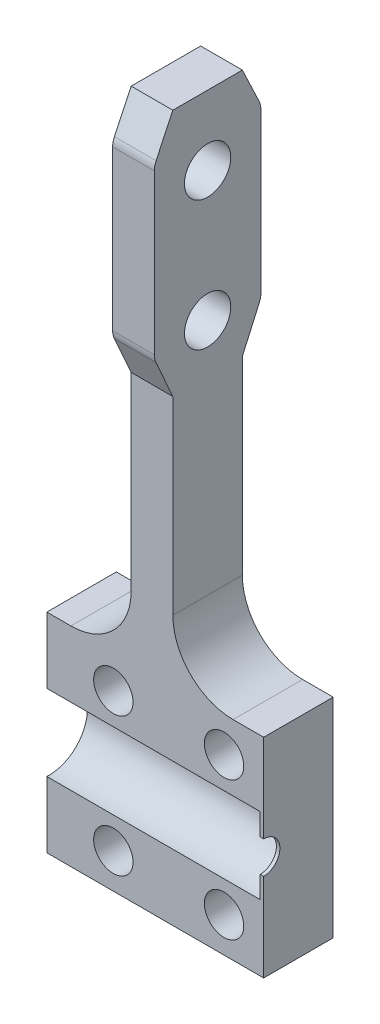
ISO-10303-21;
HEADER;
FILE_DESCRIPTION(('STEP AP214'),'2;1');
FILE_NAME('part.step','',(''),(''),'','','');
FILE_SCHEMA(('AUTOMOTIVE_DESIGN { 1 0 10303 214 1 1 1 1 }'));
ENDSEC;
DATA;
#1=APPLICATION_CONTEXT('core data for automotive mechanical design processes');
#2=APPLICATION_PROTOCOL_DEFINITION('international standard','automotive_design',2000,#1);
#3=PRODUCT_CONTEXT('',#1,'mechanical');
#4=PRODUCT('Part','Part','',(#3));
#5=PRODUCT_RELATED_PRODUCT_CATEGORY('part','',(#4));
#6=PRODUCT_DEFINITION_FORMATION('','',#4);
#7=PRODUCT_DEFINITION_CONTEXT('part definition',#1,'design');
#8=PRODUCT_DEFINITION('design','',#6,#7);
#9=PRODUCT_DEFINITION_SHAPE('','',#8);
#10=(LENGTH_UNIT() NAMED_UNIT(*) SI_UNIT(.MILLI.,.METRE.));
#11=(NAMED_UNIT(*) PLANE_ANGLE_UNIT() SI_UNIT($,.RADIAN.));
#12=(NAMED_UNIT(*) SI_UNIT($,.STERADIAN.) SOLID_ANGLE_UNIT());
#13=UNCERTAINTY_MEASURE_WITH_UNIT(LENGTH_MEASURE(1.E-05),#10,'distance_accuracy_value','');
#14=(GEOMETRIC_REPRESENTATION_CONTEXT(3) GLOBAL_UNCERTAINTY_ASSIGNED_CONTEXT((#13)) GLOBAL_UNIT_ASSIGNED_CONTEXT((#10,
#11,#12)) REPRESENTATION_CONTEXT('',''));
#15=CARTESIAN_POINT('',(0.,0.,0.));
#16=DIRECTION('',(0.,0.,1.));
#17=DIRECTION('',(1.,0.,0.));
#18=AXIS2_PLACEMENT_3D('',#15,#16,#17);
#19=CARTESIAN_POINT('',(13.9,35.5,0.));
#20=DIRECTION('',(0.,0.,1.));
#21=DIRECTION('',(1.,0.,0.));
#22=AXIS2_PLACEMENT_3D('',#19,#20,#21);
#23=PLANE('',#22);
#24=CARTESIAN_POINT('',(-11.95,14.95,0.));
#25=DIRECTION('',(0.,0.,1.));
#26=DIRECTION('',(1.,0.,0.));
#27=AXIS2_PLACEMENT_3D('',#24,#25,#26);
#28=CIRCLE('',#27,4.25);
#29=CARTESIAN_POINT('',(-7.7,14.95,0.));
#30=VERTEX_POINT('',#29);
#31=EDGE_CURVE('E295',#30,#30,#28,.T.);
#32=ORIENTED_EDGE('',*,*,#31,.T.);
#33=EDGE_LOOP('',(#32));
#34=FACE_BOUND('',#33,.T.);
#35=CARTESIAN_POINT('',(11.95,14.95,0.));
#36=DIRECTION('',(0.,0.,1.));
#37=DIRECTION('',(1.,0.,0.));
#38=AXIS2_PLACEMENT_3D('',#35,#36,#37);
#39=CIRCLE('',#38,4.25);
#40=CARTESIAN_POINT('',(16.2,14.95,0.));
#41=VERTEX_POINT('',#40);
#42=EDGE_CURVE('E299',#41,#41,#39,.T.);
#43=ORIENTED_EDGE('',*,*,#42,.T.);
#44=EDGE_LOOP('',(#43));
#45=FACE_BOUND('',#44,.T.);
#46=CARTESIAN_POINT('',(11.95,-14.95,0.));
#47=DIRECTION('',(0.,0.,1.));
#48=DIRECTION('',(1.,0.,0.));
#49=AXIS2_PLACEMENT_3D('',#46,#47,#48);
#50=CIRCLE('',#49,4.25);
#51=CARTESIAN_POINT('',(16.2,-14.95,0.));
#52=VERTEX_POINT('',#51);
#53=EDGE_CURVE('E305',#52,#52,#50,.T.);
#54=ORIENTED_EDGE('',*,*,#53,.T.);
#55=EDGE_LOOP('',(#54));
#56=FACE_BOUND('',#55,.T.);
#57=CARTESIAN_POINT('',(-11.95,-14.95,0.));
#58=DIRECTION('',(0.,0.,1.));
#59=DIRECTION('',(1.,0.,0.));
#60=AXIS2_PLACEMENT_3D('',#57,#58,#59);
#61=CIRCLE('',#60,4.25);
#62=CARTESIAN_POINT('',(-7.7,-14.95,0.));
#63=VERTEX_POINT('',#62);
#64=EDGE_CURVE('E311',#63,#63,#61,.T.);
#65=ORIENTED_EDGE('',*,*,#64,.T.);
#66=EDGE_LOOP('',(#65));
#67=FACE_BOUND('',#66,.T.);
#68=DIRECTION('',(-1.,0.,0.));
#69=VECTOR('',#68,1.);
#70=CARTESIAN_POINT('',(54.5624362774462,76.3868514547035,0.));
#71=LINE('',#70,#69);
#72=CARTESIAN_POINT('',(0.900000000000005,76.3868514547035,0.));
#73=VERTEX_POINT('',#72);
#74=CARTESIAN_POINT('',(-8.09999999999999,76.3868514547035,0.));
#75=VERTEX_POINT('',#74);
#76=EDGE_CURVE('E203',#73,#75,#71,.T.);
#77=ORIENTED_EDGE('',*,*,#76,.F.);
#78=DIRECTION('',(0.,1.,0.));
#79=VECTOR('',#78,1.);
#80=CARTESIAN_POINT('',(0.900000000000005,35.5000000000001,0.));
#81=LINE('',#80,#79);
#82=CARTESIAN_POINT('',(0.900000000000005,35.5000000000001,0.));
#83=VERTEX_POINT('',#82);
#84=EDGE_CURVE('E354',#83,#73,#81,.T.);
#85=ORIENTED_EDGE('',*,*,#84,.F.);
#86=CARTESIAN_POINT('',(13.9,35.5,0.));
#87=DIRECTION('',(0.,0.,-1.));
#88=DIRECTION('',(1.,0.,0.));
#89=AXIS2_PLACEMENT_3D('',#86,#87,#88);
#90=CIRCLE('',#89,13.);
#91=CARTESIAN_POINT('',(13.9000000000001,22.5,0.));
#92=VERTEX_POINT('',#91);
#93=EDGE_CURVE('E352',#92,#83,#90,.T.);
#94=ORIENTED_EDGE('',*,*,#93,.F.);
#95=DIRECTION('',(-1.,0.,0.));
#96=VECTOR('',#95,1.);
#97=CARTESIAN_POINT('',(20.5,22.5,0.));
#98=LINE('',#97,#96);
#99=CARTESIAN_POINT('',(20.5,22.5,0.));
#100=VERTEX_POINT('',#99);
#101=EDGE_CURVE('E350',#100,#92,#98,.T.);
#102=ORIENTED_EDGE('',*,*,#101,.F.);
#103=DIRECTION('',(0.,1.,0.));
#104=VECTOR('',#103,1.);
#105=CARTESIAN_POINT('',(20.5,-22.5,0.));
#106=LINE('',#105,#104);
#107=CARTESIAN_POINT('',(20.5,-22.5,0.));
#108=VERTEX_POINT('',#107);
#109=EDGE_CURVE('E348',#108,#100,#106,.T.);
#110=ORIENTED_EDGE('',*,*,#109,.F.);
#111=DIRECTION('',(1.,0.,0.));
#112=VECTOR('',#111,1.);
#113=CARTESIAN_POINT('',(-26.3,-22.5,0.));
#114=LINE('',#113,#112);
#115=CARTESIAN_POINT('',(-26.3,-22.5,0.));
#116=VERTEX_POINT('',#115);
#117=EDGE_CURVE('E317',#116,#108,#114,.T.);
#118=ORIENTED_EDGE('',*,*,#117,.F.);
#119=DIRECTION('',(0.,-1.,0.));
#120=VECTOR('',#119,1.);
#121=CARTESIAN_POINT('',(-26.3,22.5,0.));
#122=LINE('',#121,#120);
#123=CARTESIAN_POINT('',(-26.3,22.5,0.));
#124=VERTEX_POINT('',#123);
#125=EDGE_CURVE('E324',#124,#116,#122,.T.);
#126=ORIENTED_EDGE('',*,*,#125,.F.);
#127=DIRECTION('',(-1.,0.,0.));
#128=VECTOR('',#127,1.);
#129=CARTESIAN_POINT('',(-8.09999999999999,22.5,0.));
#130=LINE('',#129,#128);
#131=CARTESIAN_POINT('',(-21.1,22.5,0.));
#132=VERTEX_POINT('',#131);
#133=EDGE_CURVE('E361',#132,#124,#130,.T.);
#134=ORIENTED_EDGE('',*,*,#133,.F.);
#135=CARTESIAN_POINT('',(-21.1,35.5,0.));
#136=DIRECTION('',(0.,0.,1.));
#137=DIRECTION('',(1.,0.,0.));
#138=AXIS2_PLACEMENT_3D('',#135,#136,#137);
#139=CIRCLE('',#138,13.);
#140=CARTESIAN_POINT('',(-8.09999999999999,35.5,0.));
#141=VERTEX_POINT('',#140);
#142=EDGE_CURVE('E41',#132,#141,#139,.T.);
#143=ORIENTED_EDGE('',*,*,#142,.T.);
#144=DIRECTION('',(0.,-1.,0.));
#145=VECTOR('',#144,1.);
#146=CARTESIAN_POINT('',(-8.09999999999999,22.5,0.));
#147=LINE('',#146,#145);
#148=EDGE_CURVE('E359',#75,#141,#147,.T.);
#149=ORIENTED_EDGE('',*,*,#148,.F.);
#150=EDGE_LOOP('',(#77,#85,#94,#102,#110,#118,#126,#134,#143,#149));
#151=FACE_BOUND('',#150,.T.);
#152=ADVANCED_FACE('F33',(#34,#45,#56,#67,#151),#23,.F.);
#153=CARTESIAN_POINT('',(13.9,35.5,15.));
#154=DIRECTION('',(0.,0.,1.));
#155=DIRECTION('',(1.,0.,0.));
#156=AXIS2_PLACEMENT_3D('',#153,#154,#155);
#157=PLANE('',#156);
#158=DIRECTION('',(1.,0.,0.));
#159=VECTOR('',#158,1.);
#160=CARTESIAN_POINT('',(-25.55,-3.5,15.));
#161=LINE('',#160,#159);
#162=CARTESIAN_POINT('',(19.75,-3.5,15.));
#163=VERTEX_POINT('',#162);
#164=CARTESIAN_POINT('',(20.5,-3.5,15.));
#165=VERTEX_POINT('',#164);
#166=EDGE_CURVE('E275',#163,#165,#161,.T.);
#167=ORIENTED_EDGE('',*,*,#166,.F.);
#168=DIRECTION('',(0.,-1.,0.));
#169=VECTOR('',#168,1.);
#170=CARTESIAN_POINT('',(19.75,35.5,15.));
#171=LINE('',#170,#169);
#172=CARTESIAN_POINT('',(19.75,-8.2348345460003,15.));
#173=VERTEX_POINT('',#172);
#174=EDGE_CURVE('E386',#163,#173,#171,.T.);
#175=ORIENTED_EDGE('',*,*,#174,.T.);
#176=DIRECTION('',(-1.,0.,0.));
#177=VECTOR('',#176,1.);
#178=CARTESIAN_POINT('',(19.75,-8.2348345460003,15.));
#179=LINE('',#178,#177);
#180=CARTESIAN_POINT('',(-26.3,-8.2348345460003,15.));
#181=VERTEX_POINT('',#180);
#182=EDGE_CURVE('E287',#181,#173,#179,.F.);
#183=ORIENTED_EDGE('',*,*,#182,.F.);
#184=DIRECTION('',(0.,-1.,0.));
#185=VECTOR('',#184,1.);
#186=CARTESIAN_POINT('',(-26.3,22.5,15.));
#187=LINE('',#186,#185);
#188=CARTESIAN_POINT('',(-26.3,-22.5,15.));
#189=VERTEX_POINT('',#188);
#190=EDGE_CURVE('E341',#181,#189,#187,.T.);
#191=ORIENTED_EDGE('',*,*,#190,.T.);
#192=DIRECTION('',(1.,0.,0.));
#193=VECTOR('',#192,1.);
#194=CARTESIAN_POINT('',(-26.3,-22.5,15.));
#195=LINE('',#194,#193);
#196=CARTESIAN_POINT('',(20.5,-22.5,15.));
#197=VERTEX_POINT('',#196);
#198=EDGE_CURVE('E320',#189,#197,#195,.T.);
#199=ORIENTED_EDGE('',*,*,#198,.T.);
#200=DIRECTION('',(0.,1.,0.));
#201=VECTOR('',#200,1.);
#202=CARTESIAN_POINT('',(20.5,-22.5,15.));
#203=LINE('',#202,#201);
#204=EDGE_CURVE('E325',#197,#165,#203,.T.);
#205=ORIENTED_EDGE('',*,*,#204,.T.);
#206=EDGE_LOOP('',(#167,#175,#183,#191,#199,#205));
#207=FACE_BOUND('',#206,.T.);
#208=CARTESIAN_POINT('',(11.95,-14.95,15.));
#209=DIRECTION('',(0.,0.,1.));
#210=DIRECTION('',(1.,0.,0.));
#211=AXIS2_PLACEMENT_3D('',#208,#209,#210);
#212=CIRCLE('',#211,4.25);
#213=CARTESIAN_POINT('',(16.2,-14.95,15.));
#214=VERTEX_POINT('',#213);
#215=EDGE_CURVE('E308',#214,#214,#212,.T.);
#216=ORIENTED_EDGE('',*,*,#215,.F.);
#217=EDGE_LOOP('',(#216));
#218=FACE_BOUND('',#217,.T.);
#219=CARTESIAN_POINT('',(-11.95,-14.95,15.));
#220=DIRECTION('',(0.,0.,1.));
#221=DIRECTION('',(1.,0.,0.));
#222=AXIS2_PLACEMENT_3D('',#219,#220,#221);
#223=CIRCLE('',#222,4.25);
#224=CARTESIAN_POINT('',(-7.7,-14.95,15.));
#225=VERTEX_POINT('',#224);
#226=EDGE_CURVE('E314',#225,#225,#223,.T.);
#227=ORIENTED_EDGE('',*,*,#226,.F.);
#228=EDGE_LOOP('',(#227));
#229=FACE_BOUND('',#228,.T.);
#230=ADVANCED_FACE('F419',(#207,#218,#229),#157,.T.);
#231=DIRECTION('',(-1.,0.,0.));
#232=VECTOR('',#231,1.);
#233=CARTESIAN_POINT('',(54.5624362774462,76.3868514547035,15.));
#234=LINE('',#233,#232);
#235=CARTESIAN_POINT('',(0.900000000000005,76.3868514547035,15.));
#236=VERTEX_POINT('',#235);
#237=CARTESIAN_POINT('',(-8.09999999999999,76.3868514547035,15.));
#238=VERTEX_POINT('',#237);
#239=EDGE_CURVE('E259',#236,#238,#234,.T.);
#240=ORIENTED_EDGE('',*,*,#239,.T.);
#241=DIRECTION('',(0.,-1.,0.));
#242=VECTOR('',#241,1.);
#243=CARTESIAN_POINT('',(-8.09999999999999,22.5,15.));
#244=LINE('',#243,#242);
#245=CARTESIAN_POINT('',(-8.09999999999999,35.5,15.));
#246=VERTEX_POINT('',#245);
#247=EDGE_CURVE('E337',#238,#246,#244,.T.);
#248=ORIENTED_EDGE('',*,*,#247,.T.);
#249=CARTESIAN_POINT('',(-21.1,35.5,15.));
#250=DIRECTION('',(0.,0.,1.));
#251=DIRECTION('',(1.,0.,0.));
#252=AXIS2_PLACEMENT_3D('',#249,#250,#251);
#253=CIRCLE('',#252,13.);
#254=CARTESIAN_POINT('',(-21.1,22.5,15.));
#255=VERTEX_POINT('',#254);
#256=EDGE_CURVE('E11',#246,#255,#253,.F.);
#257=ORIENTED_EDGE('',*,*,#256,.T.);
#258=DIRECTION('',(-1.,0.,0.));
#259=VECTOR('',#258,1.);
#260=CARTESIAN_POINT('',(-8.09999999999999,22.5,15.));
#261=LINE('',#260,#259);
#262=CARTESIAN_POINT('',(-26.3,22.5,15.));
#263=VERTEX_POINT('',#262);
#264=EDGE_CURVE('E339',#255,#263,#261,.T.);
#265=ORIENTED_EDGE('',*,*,#264,.T.);
#266=CARTESIAN_POINT('',(-26.3,8.2348345460003,15.));
#267=VERTEX_POINT('',#266);
#268=EDGE_CURVE('E342',#263,#267,#187,.T.);
#269=ORIENTED_EDGE('',*,*,#268,.T.);
#270=DIRECTION('',(-1.,0.,0.));
#271=VECTOR('',#270,1.);
#272=CARTESIAN_POINT('',(19.75,8.2348345460003,15.));
#273=LINE('',#272,#271);
#274=CARTESIAN_POINT('',(19.75,8.2348345460003,15.));
#275=VERTEX_POINT('',#274);
#276=EDGE_CURVE('E293',#275,#267,#273,.T.);
#277=ORIENTED_EDGE('',*,*,#276,.F.);
#278=CARTESIAN_POINT('',(19.75,3.5,15.));
#279=VERTEX_POINT('',#278);
#280=EDGE_CURVE('E387',#275,#279,#171,.T.);
#281=ORIENTED_EDGE('',*,*,#280,.T.);
#282=DIRECTION('',(1.,0.,0.));
#283=VECTOR('',#282,1.);
#284=CARTESIAN_POINT('',(-25.55,3.5,15.));
#285=LINE('',#284,#283);
#286=CARTESIAN_POINT('',(20.5,3.5,15.));
#287=VERTEX_POINT('',#286);
#288=EDGE_CURVE('E273',#287,#279,#285,.F.);
#289=ORIENTED_EDGE('',*,*,#288,.F.);
#290=CARTESIAN_POINT('',(20.5,22.5,15.));
#291=VERTEX_POINT('',#290);
#292=EDGE_CURVE('E323',#287,#291,#203,.T.);
#293=ORIENTED_EDGE('',*,*,#292,.T.);
#294=DIRECTION('',(-1.,0.,0.));
#295=VECTOR('',#294,1.);
#296=CARTESIAN_POINT('',(20.5,22.5,15.));
#297=LINE('',#296,#295);
#298=CARTESIAN_POINT('',(13.9000000000001,22.5,15.));
#299=VERTEX_POINT('',#298);
#300=EDGE_CURVE('E328',#291,#299,#297,.T.);
#301=ORIENTED_EDGE('',*,*,#300,.T.);
#302=CARTESIAN_POINT('',(13.9,35.5,15.));
#303=DIRECTION('',(0.,0.,-1.));
#304=DIRECTION('',(1.,0.,0.));
#305=AXIS2_PLACEMENT_3D('',#302,#303,#304);
#306=CIRCLE('',#305,13.);
#307=CARTESIAN_POINT('',(0.900000000000005,35.5000000000001,15.));
#308=VERTEX_POINT('',#307);
#309=EDGE_CURVE('E330',#299,#308,#306,.T.);
#310=ORIENTED_EDGE('',*,*,#309,.T.);
#311=DIRECTION('',(0.,1.,0.));
#312=VECTOR('',#311,1.);
#313=CARTESIAN_POINT('',(0.900000000000005,35.5000000000001,15.));
#314=LINE('',#313,#312);
#315=EDGE_CURVE('E332',#308,#236,#314,.T.);
#316=ORIENTED_EDGE('',*,*,#315,.T.);
#317=EDGE_LOOP('',(#240,#248,#257,#265,#269,#277,#281,#289,#293,#301,#310,#316));
#318=FACE_BOUND('',#317,.T.);
#319=CARTESIAN_POINT('',(11.95,14.95,15.));
#320=DIRECTION('',(0.,0.,1.));
#321=DIRECTION('',(1.,0.,0.));
#322=AXIS2_PLACEMENT_3D('',#319,#320,#321);
#323=CIRCLE('',#322,4.25);
#324=CARTESIAN_POINT('',(16.2,14.95,15.));
#325=VERTEX_POINT('',#324);
#326=EDGE_CURVE('E302',#325,#325,#323,.T.);
#327=ORIENTED_EDGE('',*,*,#326,.F.);
#328=EDGE_LOOP('',(#327));
#329=FACE_BOUND('',#328,.T.);
#330=CARTESIAN_POINT('',(-11.95,14.95,15.));
#331=DIRECTION('',(0.,0.,1.));
#332=DIRECTION('',(1.,0.,0.));
#333=AXIS2_PLACEMENT_3D('',#330,#331,#332);
#334=CIRCLE('',#333,4.25);
#335=CARTESIAN_POINT('',(-7.7,14.95,15.));
#336=VERTEX_POINT('',#335);
#337=EDGE_CURVE('E296',#336,#336,#334,.T.);
#338=ORIENTED_EDGE('',*,*,#337,.F.);
#339=EDGE_LOOP('',(#338));
#340=FACE_BOUND('',#339,.T.);
#341=ADVANCED_FACE('F426',(#318,#329,#340),#157,.T.);
#342=CARTESIAN_POINT('',(-26.3,-22.5,15.));
#343=DIRECTION('',(0.,1.,0.));
#344=DIRECTION('',(0.,0.,1.));
#345=AXIS2_PLACEMENT_3D('',#342,#343,#344);
#346=PLANE('',#345);
#347=ORIENTED_EDGE('',*,*,#117,.T.);
#348=DIRECTION('',(0.,0.,-1.));
#349=VECTOR('',#348,1.);
#350=CARTESIAN_POINT('',(20.5,-22.5,15.));
#351=LINE('',#350,#349);
#352=EDGE_CURVE('E383',#197,#108,#351,.T.);
#353=ORIENTED_EDGE('',*,*,#352,.F.);
#354=ORIENTED_EDGE('',*,*,#198,.F.);
#355=DIRECTION('',(0.,0.,-1.));
#356=VECTOR('',#355,1.);
#357=CARTESIAN_POINT('',(-26.3,-22.5,15.));
#358=LINE('',#357,#356);
#359=EDGE_CURVE('E345',#189,#116,#358,.T.);
#360=ORIENTED_EDGE('',*,*,#359,.T.);
#361=EDGE_LOOP('',(#347,#353,#354,#360));
#362=FACE_BOUND('',#361,.T.);
#363=ADVANCED_FACE('F415',(#362),#346,.F.);
#364=CARTESIAN_POINT('',(20.5,-22.5,15.));
#365=DIRECTION('',(-1.,0.,0.));
#366=DIRECTION('',(0.,-1.,0.));
#367=AXIS2_PLACEMENT_3D('',#364,#365,#366);
#368=PLANE('',#367);
#369=ORIENTED_EDGE('',*,*,#292,.F.);
#370=CARTESIAN_POINT('',(20.5,0.,15.));
#371=DIRECTION('',(1.,0.,0.));
#372=DIRECTION('',(0.,1.,0.));
#373=AXIS2_PLACEMENT_3D('',#370,#371,#372);
#374=CIRCLE('',#373,3.5);
#375=EDGE_CURVE('E271',#165,#287,#374,.T.);
#376=ORIENTED_EDGE('',*,*,#375,.F.);
#377=ORIENTED_EDGE('',*,*,#204,.F.);
#378=ORIENTED_EDGE('',*,*,#352,.T.);
#379=ORIENTED_EDGE('',*,*,#109,.T.);
#380=DIRECTION('',(0.,0.,-1.));
#381=VECTOR('',#380,1.);
#382=CARTESIAN_POINT('',(20.5,22.5,15.));
#383=LINE('',#382,#381);
#384=EDGE_CURVE('E380',#291,#100,#383,.T.);
#385=ORIENTED_EDGE('',*,*,#384,.F.);
#386=EDGE_LOOP('',(#369,#376,#377,#378,#379,#385));
#387=FACE_BOUND('',#386,.T.);
#388=ADVANCED_FACE('F467',(#387),#368,.F.);
#389=CARTESIAN_POINT('',(20.5,22.5,15.));
#390=DIRECTION('',(0.,-1.,0.));
#391=DIRECTION('',(0.,0.,-1.));
#392=AXIS2_PLACEMENT_3D('',#389,#390,#391);
#393=PLANE('',#392);
#394=ORIENTED_EDGE('',*,*,#101,.T.);
#395=DIRECTION('',(0.,0.,-1.));
#396=VECTOR('',#395,1.);
#397=CARTESIAN_POINT('',(13.9000000000001,22.5,15.));
#398=LINE('',#397,#396);
#399=EDGE_CURVE('E377',#299,#92,#398,.T.);
#400=ORIENTED_EDGE('',*,*,#399,.F.);
#401=ORIENTED_EDGE('',*,*,#300,.F.);
#402=ORIENTED_EDGE('',*,*,#384,.T.);
#403=EDGE_LOOP('',(#394,#400,#401,#402));
#404=FACE_BOUND('',#403,.T.);
#405=ADVANCED_FACE('F463',(#404),#393,.F.);
#406=CARTESIAN_POINT('',(13.9,35.5,15.));
#407=DIRECTION('',(0.,0.,-1.));
#408=DIRECTION('',(-1.,0.,0.));
#409=AXIS2_PLACEMENT_3D('',#406,#407,#408);
#410=CYLINDRICAL_SURFACE('',#409,13.);
#411=ORIENTED_EDGE('',*,*,#93,.T.);
#412=DIRECTION('',(0.,0.,-1.));
#413=VECTOR('',#412,1.);
#414=CARTESIAN_POINT('',(0.900000000000005,35.5000000000001,15.));
#415=LINE('',#414,#413);
#416=EDGE_CURVE('E374',#308,#83,#415,.T.);
#417=ORIENTED_EDGE('',*,*,#416,.F.);
#418=ORIENTED_EDGE('',*,*,#309,.F.);
#419=ORIENTED_EDGE('',*,*,#399,.T.);
#420=EDGE_LOOP('',(#411,#417,#418,#419));
#421=FACE_BOUND('',#420,.T.);
#422=ADVANCED_FACE('F459',(#421),#410,.F.);
#423=CARTESIAN_POINT('',(0.900000000000005,35.5000000000001,15.));
#424=DIRECTION('',(-1.,0.,0.));
#425=DIRECTION('',(0.,0.,1.));
#426=AXIS2_PLACEMENT_3D('',#423,#424,#425);
#427=PLANE('',#426);
#428=CARTESIAN_POINT('',(0.900000000000005,86.9,7.5));
#429=DIRECTION('',(1.,0.,0.));
#430=DIRECTION('',(0.,0.,-1.));
#431=AXIS2_PLACEMENT_3D('',#428,#429,#430);
#432=CIRCLE('',#431,5.);
#433=CARTESIAN_POINT('',(0.900000000000005,86.9,2.5));
#434=VERTEX_POINT('',#433);
#435=EDGE_CURVE('E278',#434,#434,#432,.T.);
#436=ORIENTED_EDGE('',*,*,#435,.F.);
#437=EDGE_LOOP('',(#436));
#438=FACE_BOUND('',#437,.T.);
#439=CARTESIAN_POINT('',(0.900000000000005,114.9,7.5));
#440=DIRECTION('',(1.,0.,0.));
#441=DIRECTION('',(0.,0.,-1.));
#442=AXIS2_PLACEMENT_3D('',#439,#440,#441);
#443=CIRCLE('',#442,5.);
#444=CARTESIAN_POINT('',(0.900000000000005,114.9,2.5));
#445=VERTEX_POINT('',#444);
#446=EDGE_CURVE('E277',#445,#445,#443,.T.);
#447=ORIENTED_EDGE('',*,*,#446,.F.);
#448=EDGE_LOOP('',(#447));
#449=FACE_BOUND('',#448,.T.);
#450=ORIENTED_EDGE('',*,*,#84,.T.);
#451=DIRECTION('',(0.,0.912907574661992,-0.40816633879432));
#452=VECTOR('',#451,1.);
#453=CARTESIAN_POINT('',(0.900000000000005,76.3868514547035,0.));
#454=LINE('',#453,#452);
#455=CARTESIAN_POINT('',(0.900000000000005,84.5541123056302,-3.65163029864797));
#456=VERTEX_POINT('',#455);
#457=EDGE_CURVE('E232',#73,#456,#454,.T.);
#458=ORIENTED_EDGE('',*,*,#457,.T.);
#459=CARTESIAN_POINT('',(0.900000000000005,86.1867776608075,0.));
#460=DIRECTION('',(-1.,0.,0.));
#461=DIRECTION('',(0.,0.,1.));
#462=AXIS2_PLACEMENT_3D('',#459,#460,#461);
#463=CIRCLE('',#462,4.);
#464=CARTESIAN_POINT('',(0.900000000000005,86.1867776608075,-3.99999999999999));
#465=VERTEX_POINT('',#464);
#466=EDGE_CURVE('E200',#456,#465,#463,.F.);
#467=ORIENTED_EDGE('',*,*,#466,.T.);
#468=DIRECTION('',(0.,1.,0.));
#469=VECTOR('',#468,1.);
#470=CARTESIAN_POINT('',(0.900000000000005,86.1867776608075,-3.99999999999999));
#471=LINE('',#470,#469);
#472=CARTESIAN_POINT('',(0.900000000000005,120.550049195899,-4.));
#473=VERTEX_POINT('',#472);
#474=EDGE_CURVE('E770',#465,#473,#471,.T.);
#475=ORIENTED_EDGE('',*,*,#474,.T.);
#476=CARTESIAN_POINT('',(0.900000000000005,120.550049195899,0.));
#477=DIRECTION('',(-1.,0.,0.));
#478=DIRECTION('',(0.,0.,1.));
#479=AXIS2_PLACEMENT_3D('',#476,#477,#478);
#480=CIRCLE('',#479,4.);
#481=CARTESIAN_POINT('',(0.900000000000005,122.261288146267,-3.61547524604226));
#482=VERTEX_POINT('',#481);
#483=EDGE_CURVE('E771',#473,#482,#480,.F.);
#484=ORIENTED_EDGE('',*,*,#483,.T.);
#485=DIRECTION('',(0.,0.903868811510564,0.427809737591936));
#486=VECTOR('',#485,1.);
#487=CARTESIAN_POINT('',(0.900000000000005,122.261288146267,-3.61547524604226));
#488=LINE('',#487,#486);
#489=CARTESIAN_POINT('',(0.900000000000005,129.9,0.));
#490=VERTEX_POINT('',#489);
#491=EDGE_CURVE('E226',#482,#490,#488,.T.);
#492=ORIENTED_EDGE('',*,*,#491,.T.);
#493=DIRECTION('',(0.,0.,-1.));
#494=VECTOR('',#493,1.);
#495=CARTESIAN_POINT('',(0.900000000000005,129.9,15.));
#496=LINE('',#495,#494);
#497=CARTESIAN_POINT('',(0.900000000000005,129.9,15.));
#498=VERTEX_POINT('',#497);
#499=EDGE_CURVE('E372',#498,#490,#496,.T.);
#500=ORIENTED_EDGE('',*,*,#499,.F.);
#501=DIRECTION('',(0.,-0.903868811510564,0.427809737591936));
#502=VECTOR('',#501,1.);
#503=CARTESIAN_POINT('',(0.900000000000005,122.261288146267,18.6154752460423));
#504=LINE('',#503,#502);
#505=CARTESIAN_POINT('',(0.900000000000005,122.261288146267,18.6154752460423));
#506=VERTEX_POINT('',#505);
#507=EDGE_CURVE('E242',#498,#506,#504,.T.);
#508=ORIENTED_EDGE('',*,*,#507,.T.);
#509=CARTESIAN_POINT('',(0.900000000000005,120.550049195899,15.));
#510=DIRECTION('',(-1.,0.,0.));
#511=DIRECTION('',(0.,0.,1.));
#512=AXIS2_PLACEMENT_3D('',#509,#510,#511);
#513=CIRCLE('',#512,4.);
#514=CARTESIAN_POINT('',(0.900000000000005,120.550049195899,19.));
#515=VERTEX_POINT('',#514);
#516=EDGE_CURVE('E240',#506,#515,#513,.F.);
#517=ORIENTED_EDGE('',*,*,#516,.T.);
#518=DIRECTION('',(0.,-1.,0.));
#519=VECTOR('',#518,1.);
#520=CARTESIAN_POINT('',(0.900000000000005,86.1867776608075,19.));
#521=LINE('',#520,#519);
#522=CARTESIAN_POINT('',(0.900000000000005,86.1867776608075,19.));
#523=VERTEX_POINT('',#522);
#524=EDGE_CURVE('E237',#515,#523,#521,.T.);
#525=ORIENTED_EDGE('',*,*,#524,.T.);
#526=CARTESIAN_POINT('',(0.900000000000005,86.1867776608075,15.));
#527=DIRECTION('',(-1.,0.,0.));
#528=DIRECTION('',(0.,0.,1.));
#529=AXIS2_PLACEMENT_3D('',#526,#527,#528);
#530=CIRCLE('',#529,4.);
#531=CARTESIAN_POINT('',(0.900000000000005,84.5541123056302,18.651630298648));
#532=VERTEX_POINT('',#531);
#533=EDGE_CURVE('E235',#523,#532,#530,.F.);
#534=ORIENTED_EDGE('',*,*,#533,.T.);
#535=DIRECTION('',(0.,-0.912907574661992,-0.408166338794321));
#536=VECTOR('',#535,1.);
#537=CARTESIAN_POINT('',(0.900000000000005,76.3868514547035,15.));
#538=LINE('',#537,#536);
#539=EDGE_CURVE('E244',#532,#236,#538,.T.);
#540=ORIENTED_EDGE('',*,*,#539,.T.);
#541=ORIENTED_EDGE('',*,*,#315,.F.);
#542=ORIENTED_EDGE('',*,*,#416,.T.);
#543=EDGE_LOOP('',(#450,#458,#467,#475,#484,#492,#500,#508,#517,#525,#534,#540,#541,#542));
#544=FACE_BOUND('',#543,.T.);
#545=ADVANCED_FACE('F455',(#438,#449,#544),#427,.F.);
#546=CARTESIAN_POINT('',(-8.09999999999999,129.9,15.));
#547=DIRECTION('',(0.,-1.,0.));
#548=DIRECTION('',(0.,0.,-1.));
#549=AXIS2_PLACEMENT_3D('',#546,#547,#548);
#550=PLANE('',#549);
#551=DIRECTION('',(-1.,0.,0.));
#552=VECTOR('',#551,1.);
#553=CARTESIAN_POINT('',(-8.09999999999999,129.9,0.));
#554=LINE('',#553,#552);
#555=CARTESIAN_POINT('',(-8.09999999999999,129.9,0.));
#556=VERTEX_POINT('',#555);
#557=EDGE_CURVE('E357',#490,#556,#554,.T.);
#558=ORIENTED_EDGE('',*,*,#557,.T.);
#559=DIRECTION('',(0.,0.,-1.));
#560=VECTOR('',#559,1.);
#561=CARTESIAN_POINT('',(-8.09999999999999,129.9,15.));
#562=LINE('',#561,#560);
#563=CARTESIAN_POINT('',(-8.09999999999999,129.9,15.));
#564=VERTEX_POINT('',#563);
#565=EDGE_CURVE('E369',#564,#556,#562,.T.);
#566=ORIENTED_EDGE('',*,*,#565,.F.);
#567=DIRECTION('',(-1.,0.,0.));
#568=VECTOR('',#567,1.);
#569=CARTESIAN_POINT('',(-8.09999999999999,129.9,15.));
#570=LINE('',#569,#568);
#571=EDGE_CURVE('E334',#498,#564,#570,.T.);
#572=ORIENTED_EDGE('',*,*,#571,.F.);
#573=ORIENTED_EDGE('',*,*,#499,.T.);
#574=EDGE_LOOP('',(#558,#566,#572,#573));
#575=FACE_BOUND('',#574,.T.);
#576=ADVANCED_FACE('F451',(#575),#550,.F.);
#577=CARTESIAN_POINT('',(-8.09999999999999,22.5,15.));
#578=DIRECTION('',(1.,0.,0.));
#579=DIRECTION('',(0.,0.,-1.));
#580=AXIS2_PLACEMENT_3D('',#577,#578,#579);
#581=PLANE('',#580);
#582=CARTESIAN_POINT('',(-8.1,86.9,7.5));
#583=DIRECTION('',(1.,0.,0.));
#584=DIRECTION('',(0.,0.,-1.));
#585=AXIS2_PLACEMENT_3D('',#582,#583,#584);
#586=CIRCLE('',#585,5.);
#587=CARTESIAN_POINT('',(-8.1,86.9,2.5));
#588=VERTEX_POINT('',#587);
#589=EDGE_CURVE('E290',#588,#588,#586,.T.);
#590=ORIENTED_EDGE('',*,*,#589,.T.);
#591=EDGE_LOOP('',(#590));
#592=FACE_BOUND('',#591,.T.);
#593=CARTESIAN_POINT('',(-8.1,114.9,7.5));
#594=DIRECTION('',(1.,0.,0.));
#595=DIRECTION('',(0.,0.,-1.));
#596=AXIS2_PLACEMENT_3D('',#593,#594,#595);
#597=CIRCLE('',#596,5.);
#598=CARTESIAN_POINT('',(-8.1,114.9,2.5));
#599=VERTEX_POINT('',#598);
#600=EDGE_CURVE('E281',#599,#599,#597,.T.);
#601=ORIENTED_EDGE('',*,*,#600,.T.);
#602=EDGE_LOOP('',(#601));
#603=FACE_BOUND('',#602,.T.);
#604=ORIENTED_EDGE('',*,*,#148,.T.);
#605=DIRECTION('',(0.,0.,-1.));
#606=VECTOR('',#605,1.);
#607=CARTESIAN_POINT('',(-8.09999999999999,35.5,15.));
#608=LINE('',#607,#606);
#609=EDGE_CURVE('E48',#141,#246,#608,.F.);
#610=ORIENTED_EDGE('',*,*,#609,.T.);
#611=ORIENTED_EDGE('',*,*,#247,.F.);
#612=DIRECTION('',(0.,0.912907574661992,0.408166338794321));
#613=VECTOR('',#612,1.);
#614=CARTESIAN_POINT('',(-8.09999999999999,76.3868514547035,15.));
#615=LINE('',#614,#613);
#616=CARTESIAN_POINT('',(-8.09999999999999,84.5541123056302,18.651630298648));
#617=VERTEX_POINT('',#616);
#618=EDGE_CURVE('E234',#238,#617,#615,.T.);
#619=ORIENTED_EDGE('',*,*,#618,.T.);
#620=CARTESIAN_POINT('',(-8.09999999999999,86.1867776608075,15.));
#621=DIRECTION('',(-1.,0.,0.));
#622=DIRECTION('',(0.,0.,1.));
#623=AXIS2_PLACEMENT_3D('',#620,#621,#622);
#624=CIRCLE('',#623,4.);
#625=CARTESIAN_POINT('',(-8.09999999999999,86.1867776608075,19.));
#626=VERTEX_POINT('',#625);
#627=EDGE_CURVE('E247',#617,#626,#624,.T.);
#628=ORIENTED_EDGE('',*,*,#627,.T.);
#629=DIRECTION('',(0.,1.,0.));
#630=VECTOR('',#629,1.);
#631=CARTESIAN_POINT('',(-8.09999999999999,86.1867776608075,19.));
#632=LINE('',#631,#630);
#633=CARTESIAN_POINT('',(-8.09999999999999,120.550049195899,19.));
#634=VERTEX_POINT('',#633);
#635=EDGE_CURVE('E250',#626,#634,#632,.T.);
#636=ORIENTED_EDGE('',*,*,#635,.T.);
#637=CARTESIAN_POINT('',(-8.09999999999999,120.550049195899,15.));
#638=DIRECTION('',(-1.,0.,0.));
#639=DIRECTION('',(0.,0.,1.));
#640=AXIS2_PLACEMENT_3D('',#637,#638,#639);
#641=CIRCLE('',#640,4.);
#642=CARTESIAN_POINT('',(-8.09999999999999,122.261288146267,18.6154752460423));
#643=VERTEX_POINT('',#642);
#644=EDGE_CURVE('E253',#634,#643,#641,.T.);
#645=ORIENTED_EDGE('',*,*,#644,.T.);
#646=DIRECTION('',(0.,0.903868811510564,-0.427809737591936));
#647=VECTOR('',#646,1.);
#648=CARTESIAN_POINT('',(-8.09999999999999,122.261288146267,18.6154752460423));
#649=LINE('',#648,#647);
#650=EDGE_CURVE('E256',#643,#564,#649,.T.);
#651=ORIENTED_EDGE('',*,*,#650,.T.);
#652=ORIENTED_EDGE('',*,*,#565,.T.);
#653=DIRECTION('',(0.,-0.903868811510564,-0.427809737591936));
#654=VECTOR('',#653,1.);
#655=CARTESIAN_POINT('',(-8.09999999999999,122.261288146267,-3.61547524604226));
#656=LINE('',#655,#654);
#657=CARTESIAN_POINT('',(-8.09999999999999,122.261288146267,-3.61547524604226));
#658=VERTEX_POINT('',#657);
#659=EDGE_CURVE('E210',#556,#658,#656,.T.);
#660=ORIENTED_EDGE('',*,*,#659,.T.);
#661=CARTESIAN_POINT('',(-8.09999999999999,120.550049195899,0.));
#662=DIRECTION('',(-1.,0.,0.));
#663=DIRECTION('',(0.,0.,-1.));
#664=AXIS2_PLACEMENT_3D('',#661,#662,#663);
#665=CIRCLE('',#664,4.);
#666=CARTESIAN_POINT('',(-8.09999999999999,120.550049195899,-4.));
#667=VERTEX_POINT('',#666);
#668=EDGE_CURVE('E221',#658,#667,#665,.T.);
#669=ORIENTED_EDGE('',*,*,#668,.T.);
#670=DIRECTION('',(0.,-1.,0.));
#671=VECTOR('',#670,1.);
#672=CARTESIAN_POINT('',(-8.09999999999999,86.1867776608075,-3.99999999999999));
#673=LINE('',#672,#671);
#674=CARTESIAN_POINT('',(-8.09999999999999,86.1867776608075,-3.99999999999999));
#675=VERTEX_POINT('',#674);
#676=EDGE_CURVE('E204',#667,#675,#673,.T.);
#677=ORIENTED_EDGE('',*,*,#676,.T.);
#678=CARTESIAN_POINT('',(-8.09999999999999,86.1867776608075,0.));
#679=DIRECTION('',(-1.,0.,0.));
#680=DIRECTION('',(0.,0.,-1.));
#681=AXIS2_PLACEMENT_3D('',#678,#679,#680);
#682=CIRCLE('',#681,4.);
#683=CARTESIAN_POINT('',(-8.09999999999999,84.5541123056302,-3.65163029864797));
#684=VERTEX_POINT('',#683);
#685=EDGE_CURVE('E198',#675,#684,#682,.T.);
#686=ORIENTED_EDGE('',*,*,#685,.T.);
#687=DIRECTION('',(0.,-0.912907574661992,0.40816633879432));
#688=VECTOR('',#687,1.);
#689=CARTESIAN_POINT('',(-8.09999999999999,76.3868514547035,0.));
#690=LINE('',#689,#688);
#691=EDGE_CURVE('E208',#684,#75,#690,.T.);
#692=ORIENTED_EDGE('',*,*,#691,.T.);
#693=EDGE_LOOP('',(#604,#610,#611,#619,#628,#636,#645,#651,#652,#660,#669,#677,#686,#692));
#694=FACE_BOUND('',#693,.T.);
#695=ADVANCED_FACE('F212',(#592,#603,#694),#581,.F.);
#696=CARTESIAN_POINT('',(-8.09999999999999,22.5,15.));
#697=DIRECTION('',(0.,-1.,0.));
#698=DIRECTION('',(0.,0.,-1.));
#699=AXIS2_PLACEMENT_3D('',#696,#697,#698);
#700=PLANE('',#699);
#701=ORIENTED_EDGE('',*,*,#264,.F.);
#702=DIRECTION('',(0.,0.,-1.));
#703=VECTOR('',#702,1.);
#704=CARTESIAN_POINT('',(-21.1,22.5,0.));
#705=LINE('',#704,#703);
#706=EDGE_CURVE('E396',#255,#132,#705,.T.);
#707=ORIENTED_EDGE('',*,*,#706,.T.);
#708=ORIENTED_EDGE('',*,*,#133,.T.);
#709=DIRECTION('',(0.,0.,-1.));
#710=VECTOR('',#709,1.);
#711=CARTESIAN_POINT('',(-26.3,22.5,15.));
#712=LINE('',#711,#710);
#713=EDGE_CURVE('E366',#263,#124,#712,.T.);
#714=ORIENTED_EDGE('',*,*,#713,.F.);
#715=EDGE_LOOP('',(#701,#707,#708,#714));
#716=FACE_BOUND('',#715,.T.);
#717=ADVANCED_FACE('F402',(#716),#700,.F.);
#718=CARTESIAN_POINT('',(-26.3,22.5,15.));
#719=DIRECTION('',(1.,0.,0.));
#720=DIRECTION('',(0.,0.,-1.));
#721=AXIS2_PLACEMENT_3D('',#718,#719,#720);
#722=PLANE('',#721);
#723=ORIENTED_EDGE('',*,*,#190,.F.);
#724=CARTESIAN_POINT('',(-26.3,0.,14.5));
#725=DIRECTION('',(-1.,0.,0.));
#726=DIRECTION('',(0.,0.,1.));
#727=AXIS2_PLACEMENT_3D('',#724,#725,#726);
#728=CIRCLE('',#727,8.25);
#729=EDGE_CURVE('E288',#267,#181,#728,.T.);
#730=ORIENTED_EDGE('',*,*,#729,.F.);
#731=ORIENTED_EDGE('',*,*,#268,.F.);
#732=ORIENTED_EDGE('',*,*,#713,.T.);
#733=ORIENTED_EDGE('',*,*,#125,.T.);
#734=ORIENTED_EDGE('',*,*,#359,.F.);
#735=EDGE_LOOP('',(#723,#730,#731,#732,#733,#734));
#736=FACE_BOUND('',#735,.T.);
#737=ADVANCED_FACE('F411',(#736),#722,.F.);
#738=CARTESIAN_POINT('',(-11.95,-14.95,15.));
#739=DIRECTION('',(0.,0.,-1.));
#740=DIRECTION('',(-1.,0.,0.));
#741=AXIS2_PLACEMENT_3D('',#738,#739,#740);
#742=CYLINDRICAL_SURFACE('',#741,4.25);
#743=ORIENTED_EDGE('',*,*,#226,.T.);
#744=EDGE_LOOP('',(#743));
#745=FACE_BOUND('',#744,.T.);
#746=ORIENTED_EDGE('',*,*,#64,.F.);
#747=EDGE_LOOP('',(#746));
#748=FACE_BOUND('',#747,.T.);
#749=ADVANCED_FACE('F446',(#745,#748),#742,.F.);
#750=CARTESIAN_POINT('',(11.95,-14.95,15.));
#751=DIRECTION('',(0.,0.,-1.));
#752=DIRECTION('',(-1.,0.,0.));
#753=AXIS2_PLACEMENT_3D('',#750,#751,#752);
#754=CYLINDRICAL_SURFACE('',#753,4.25);
#755=ORIENTED_EDGE('',*,*,#215,.T.);
#756=EDGE_LOOP('',(#755));
#757=FACE_BOUND('',#756,.T.);
#758=ORIENTED_EDGE('',*,*,#53,.F.);
#759=EDGE_LOOP('',(#758));
#760=FACE_BOUND('',#759,.T.);
#761=ADVANCED_FACE('F666',(#757,#760),#754,.F.);
#762=CARTESIAN_POINT('',(11.95,14.95,15.));
#763=DIRECTION('',(0.,0.,-1.));
#764=DIRECTION('',(-1.,0.,0.));
#765=AXIS2_PLACEMENT_3D('',#762,#763,#764);
#766=CYLINDRICAL_SURFACE('',#765,4.25);
#767=ORIENTED_EDGE('',*,*,#326,.T.);
#768=EDGE_LOOP('',(#767));
#769=FACE_BOUND('',#768,.T.);
#770=ORIENTED_EDGE('',*,*,#42,.F.);
#771=EDGE_LOOP('',(#770));
#772=FACE_BOUND('',#771,.T.);
#773=ADVANCED_FACE('F676',(#769,#772),#766,.F.);
#774=CARTESIAN_POINT('',(-11.95,14.95,15.));
#775=DIRECTION('',(0.,0.,-1.));
#776=DIRECTION('',(-1.,0.,0.));
#777=AXIS2_PLACEMENT_3D('',#774,#775,#776);
#778=CYLINDRICAL_SURFACE('',#777,4.25);
#779=ORIENTED_EDGE('',*,*,#337,.T.);
#780=EDGE_LOOP('',(#779));
#781=FACE_BOUND('',#780,.T.);
#782=ORIENTED_EDGE('',*,*,#31,.F.);
#783=EDGE_LOOP('',(#782));
#784=FACE_BOUND('',#783,.T.);
#785=ADVANCED_FACE('F686',(#781,#784),#778,.F.);
#786=CARTESIAN_POINT('',(19.75,0.,14.5));
#787=DIRECTION('',(-1.,0.,0.));
#788=DIRECTION('',(0.,0.,1.));
#789=AXIS2_PLACEMENT_3D('',#786,#787,#788);
#790=CYLINDRICAL_SURFACE('',#789,8.25);
#791=ORIENTED_EDGE('',*,*,#276,.T.);
#792=ORIENTED_EDGE('',*,*,#729,.T.);
#793=ORIENTED_EDGE('',*,*,#182,.T.);
#794=CARTESIAN_POINT('',(19.75,0.,14.5));
#795=DIRECTION('',(-1.,0.,0.));
#796=DIRECTION('',(0.,0.,1.));
#797=AXIS2_PLACEMENT_3D('',#794,#795,#796);
#798=CIRCLE('',#797,8.25);
#799=EDGE_CURVE('E284',#275,#173,#798,.T.);
#800=ORIENTED_EDGE('',*,*,#799,.F.);
#801=EDGE_LOOP('',(#791,#792,#793,#800));
#802=FACE_BOUND('',#801,.T.);
#803=ADVANCED_FACE('F508',(#802),#790,.F.);
#804=CARTESIAN_POINT('',(19.75,0.,14.5));
#805=DIRECTION('',(-1.,0.,0.));
#806=DIRECTION('',(0.,0.,1.));
#807=AXIS2_PLACEMENT_3D('',#804,#805,#806);
#808=PLANE('',#807);
#809=CARTESIAN_POINT('',(19.75,0.,15.));
#810=DIRECTION('',(-1.,0.,0.));
#811=DIRECTION('',(0.,0.,1.));
#812=AXIS2_PLACEMENT_3D('',#809,#810,#811);
#813=CIRCLE('',#812,3.5);
#814=EDGE_CURVE('E390',#279,#163,#813,.T.);
#815=ORIENTED_EDGE('',*,*,#814,.F.);
#816=ORIENTED_EDGE('',*,*,#280,.F.);
#817=ORIENTED_EDGE('',*,*,#799,.T.);
#818=ORIENTED_EDGE('',*,*,#174,.F.);
#819=EDGE_LOOP('',(#815,#816,#817,#818));
#820=FACE_BOUND('',#819,.T.);
#821=ADVANCED_FACE('F502',(#820),#808,.T.);
#822=CARTESIAN_POINT('',(-45.15,114.9,7.5));
#823=DIRECTION('',(1.,0.,0.));
#824=DIRECTION('',(0.,0.,-1.));
#825=AXIS2_PLACEMENT_3D('',#822,#823,#824);
#826=CYLINDRICAL_SURFACE('',#825,5.);
#827=ORIENTED_EDGE('',*,*,#446,.T.);
#828=EDGE_LOOP('',(#827));
#829=FACE_BOUND('',#828,.T.);
#830=ORIENTED_EDGE('',*,*,#600,.F.);
#831=EDGE_LOOP('',(#830));
#832=FACE_BOUND('',#831,.T.);
#833=ADVANCED_FACE('F507',(#829,#832),#826,.F.);
#834=CARTESIAN_POINT('',(-45.15,86.9,7.5));
#835=DIRECTION('',(1.,0.,0.));
#836=DIRECTION('',(0.,0.,-1.));
#837=AXIS2_PLACEMENT_3D('',#834,#835,#836);
#838=CYLINDRICAL_SURFACE('',#837,5.);
#839=ORIENTED_EDGE('',*,*,#435,.T.);
#840=EDGE_LOOP('',(#839));
#841=FACE_BOUND('',#840,.T.);
#842=ORIENTED_EDGE('',*,*,#589,.F.);
#843=EDGE_LOOP('',(#842));
#844=FACE_BOUND('',#843,.T.);
#845=ADVANCED_FACE('F490',(#841,#844),#838,.F.);
#846=CARTESIAN_POINT('',(-25.55,0.,15.));
#847=DIRECTION('',(1.,0.,0.));
#848=DIRECTION('',(0.,1.,0.));
#849=AXIS2_PLACEMENT_3D('',#846,#847,#848);
#850=CYLINDRICAL_SURFACE('',#849,3.5);
#851=ORIENTED_EDGE('',*,*,#166,.T.);
#852=ORIENTED_EDGE('',*,*,#375,.T.);
#853=ORIENTED_EDGE('',*,*,#288,.T.);
#854=ORIENTED_EDGE('',*,*,#814,.T.);
#855=EDGE_LOOP('',(#851,#852,#853,#854));
#856=FACE_BOUND('',#855,.T.);
#857=ADVANCED_FACE('F518',(#856),#850,.F.);
#858=CARTESIAN_POINT('',(54.5624362774462,122.261288146267,18.6154752460423));
#859=DIRECTION('',(0.,0.427809737591936,0.903868811510564));
#860=DIRECTION('',(0.,-0.903868811510564,0.427809737591936));
#861=AXIS2_PLACEMENT_3D('',#858,#859,#860);
#862=PLANE('',#861);
#863=ORIENTED_EDGE('',*,*,#507,.F.);
#864=ORIENTED_EDGE('',*,*,#571,.T.);
#865=ORIENTED_EDGE('',*,*,#650,.F.);
#866=DIRECTION('',(-1.,0.,0.));
#867=VECTOR('',#866,1.);
#868=CARTESIAN_POINT('',(54.5624362774462,122.261288146267,18.6154752460423));
#869=LINE('',#868,#867);
#870=EDGE_CURVE('E238',#506,#643,#869,.T.);
#871=ORIENTED_EDGE('',*,*,#870,.F.);
#872=EDGE_LOOP('',(#863,#864,#865,#871));
#873=FACE_BOUND('',#872,.T.);
#874=ADVANCED_FACE('F522',(#873),#862,.T.);
#875=CARTESIAN_POINT('',(54.5624362774462,120.550049195899,15.));
#876=DIRECTION('',(-1.,0.,0.));
#877=DIRECTION('',(0.,0.,1.));
#878=AXIS2_PLACEMENT_3D('',#875,#876,#877);
#879=CYLINDRICAL_SURFACE('',#878,4.);
#880=ORIENTED_EDGE('',*,*,#516,.F.);
#881=ORIENTED_EDGE('',*,*,#870,.T.);
#882=ORIENTED_EDGE('',*,*,#644,.F.);
#883=DIRECTION('',(-1.,0.,0.));
#884=VECTOR('',#883,1.);
#885=CARTESIAN_POINT('',(54.5624362774462,120.550049195899,19.));
#886=LINE('',#885,#884);
#887=EDGE_CURVE('E261',#515,#634,#886,.T.);
#888=ORIENTED_EDGE('',*,*,#887,.F.);
#889=EDGE_LOOP('',(#880,#881,#882,#888));
#890=FACE_BOUND('',#889,.T.);
#891=ADVANCED_FACE('F549',(#890),#879,.T.);
#892=CARTESIAN_POINT('',(54.5624362774462,86.1867776608075,19.));
#893=DIRECTION('',(0.,0.,1.));
#894=DIRECTION('',(1.,0.,0.));
#895=AXIS2_PLACEMENT_3D('',#892,#893,#894);
#896=PLANE('',#895);
#897=ORIENTED_EDGE('',*,*,#524,.F.);
#898=ORIENTED_EDGE('',*,*,#887,.T.);
#899=ORIENTED_EDGE('',*,*,#635,.F.);
#900=DIRECTION('',(-1.,0.,0.));
#901=VECTOR('',#900,1.);
#902=CARTESIAN_POINT('',(54.5624362774462,86.1867776608075,19.));
#903=LINE('',#902,#901);
#904=EDGE_CURVE('E263',#523,#626,#903,.T.);
#905=ORIENTED_EDGE('',*,*,#904,.F.);
#906=EDGE_LOOP('',(#897,#898,#899,#905));
#907=FACE_BOUND('',#906,.T.);
#908=ADVANCED_FACE('F560',(#907),#896,.T.);
#909=CARTESIAN_POINT('',(54.5624362774462,86.1867776608075,15.));
#910=DIRECTION('',(-1.,0.,0.));
#911=DIRECTION('',(0.,0.,1.));
#912=AXIS2_PLACEMENT_3D('',#909,#910,#911);
#913=CYLINDRICAL_SURFACE('',#912,4.);
#914=ORIENTED_EDGE('',*,*,#533,.F.);
#915=ORIENTED_EDGE('',*,*,#904,.T.);
#916=ORIENTED_EDGE('',*,*,#627,.F.);
#917=DIRECTION('',(-1.,0.,0.));
#918=VECTOR('',#917,1.);
#919=CARTESIAN_POINT('',(54.5624362774462,84.5541123056302,18.651630298648));
#920=LINE('',#919,#918);
#921=EDGE_CURVE('E265',#532,#617,#920,.T.);
#922=ORIENTED_EDGE('',*,*,#921,.F.);
#923=EDGE_LOOP('',(#914,#915,#916,#922));
#924=FACE_BOUND('',#923,.T.);
#925=ADVANCED_FACE('F570',(#924),#913,.T.);
#926=CARTESIAN_POINT('',(54.5624362774462,76.3868514547035,15.));
#927=DIRECTION('',(0.,-0.408166338794321,0.912907574661992));
#928=DIRECTION('',(0.,-0.912907574661992,-0.408166338794321));
#929=AXIS2_PLACEMENT_3D('',#926,#927,#928);
#930=PLANE('',#929);
#931=ORIENTED_EDGE('',*,*,#539,.F.);
#932=ORIENTED_EDGE('',*,*,#921,.T.);
#933=ORIENTED_EDGE('',*,*,#618,.F.);
#934=ORIENTED_EDGE('',*,*,#239,.F.);
#935=EDGE_LOOP('',(#931,#932,#933,#934));
#936=FACE_BOUND('',#935,.T.);
#937=ADVANCED_FACE('F580',(#936),#930,.T.);
#938=CARTESIAN_POINT('',(54.5624362774462,86.1867776608075,0.));
#939=DIRECTION('',(-1.,0.,0.));
#940=DIRECTION('',(0.,0.,1.));
#941=AXIS2_PLACEMENT_3D('',#938,#939,#940);
#942=CYLINDRICAL_SURFACE('',#941,4.);
#943=ORIENTED_EDGE('',*,*,#466,.F.);
#944=DIRECTION('',(-1.,0.,0.));
#945=VECTOR('',#944,1.);
#946=CARTESIAN_POINT('',(54.5624362774462,84.5541123056302,-3.65163029864797));
#947=LINE('',#946,#945);
#948=EDGE_CURVE('E193',#456,#684,#947,.T.);
#949=ORIENTED_EDGE('',*,*,#948,.T.);
#950=ORIENTED_EDGE('',*,*,#685,.F.);
#951=DIRECTION('',(-1.,0.,0.));
#952=VECTOR('',#951,1.);
#953=CARTESIAN_POINT('',(54.5624362774462,86.1867776608075,-3.99999999999999));
#954=LINE('',#953,#952);
#955=EDGE_CURVE('E224',#465,#675,#954,.T.);
#956=ORIENTED_EDGE('',*,*,#955,.F.);
#957=EDGE_LOOP('',(#943,#949,#950,#956));
#958=FACE_BOUND('',#957,.T.);
#959=ADVANCED_FACE('F195',(#958),#942,.T.);
#960=CARTESIAN_POINT('',(54.5624362774462,86.1867776608075,-3.99999999999999));
#961=DIRECTION('',(0.,0.,-1.));
#962=DIRECTION('',(0.,1.,0.));
#963=AXIS2_PLACEMENT_3D('',#960,#961,#962);
#964=PLANE('',#963);
#965=ORIENTED_EDGE('',*,*,#474,.F.);
#966=ORIENTED_EDGE('',*,*,#955,.T.);
#967=ORIENTED_EDGE('',*,*,#676,.F.);
#968=DIRECTION('',(-1.,0.,0.));
#969=VECTOR('',#968,1.);
#970=CARTESIAN_POINT('',(54.5624362774462,120.550049195899,-4.));
#971=LINE('',#970,#969);
#972=EDGE_CURVE('E227',#473,#667,#971,.T.);
#973=ORIENTED_EDGE('',*,*,#972,.F.);
#974=EDGE_LOOP('',(#965,#966,#967,#973));
#975=FACE_BOUND('',#974,.T.);
#976=ADVANCED_FACE('F599',(#975),#964,.T.);
#977=CARTESIAN_POINT('',(54.5624362774462,120.550049195899,0.));
#978=DIRECTION('',(-1.,0.,0.));
#979=DIRECTION('',(0.,0.,1.));
#980=AXIS2_PLACEMENT_3D('',#977,#978,#979);
#981=CYLINDRICAL_SURFACE('',#980,4.);
#982=ORIENTED_EDGE('',*,*,#483,.F.);
#983=ORIENTED_EDGE('',*,*,#972,.T.);
#984=ORIENTED_EDGE('',*,*,#668,.F.);
#985=DIRECTION('',(-1.,0.,0.));
#986=VECTOR('',#985,1.);
#987=CARTESIAN_POINT('',(54.5624362774462,122.261288146267,-3.61547524604226));
#988=LINE('',#987,#986);
#989=EDGE_CURVE('E229',#482,#658,#988,.T.);
#990=ORIENTED_EDGE('',*,*,#989,.F.);
#991=EDGE_LOOP('',(#982,#983,#984,#990));
#992=FACE_BOUND('',#991,.T.);
#993=ADVANCED_FACE('F608',(#992),#981,.T.);
#994=CARTESIAN_POINT('',(54.5624362774462,122.261288146267,-3.61547524604226));
#995=DIRECTION('',(0.,0.427809737591936,-0.903868811510564));
#996=DIRECTION('',(0.,0.903868811510564,0.427809737591936));
#997=AXIS2_PLACEMENT_3D('',#994,#995,#996);
#998=PLANE('',#997);
#999=ORIENTED_EDGE('',*,*,#491,.F.);
#1000=ORIENTED_EDGE('',*,*,#989,.T.);
#1001=ORIENTED_EDGE('',*,*,#659,.F.);
#1002=ORIENTED_EDGE('',*,*,#557,.F.);
#1003=EDGE_LOOP('',(#999,#1000,#1001,#1002));
#1004=FACE_BOUND('',#1003,.T.);
#1005=ADVANCED_FACE('F432',(#1004),#998,.T.);
#1006=CARTESIAN_POINT('',(54.5624362774462,76.3868514547035,0.));
#1007=DIRECTION('',(0.,-0.40816633879432,-0.912907574661992));
#1008=DIRECTION('',(0.,0.912907574661992,-0.40816633879432));
#1009=AXIS2_PLACEMENT_3D('',#1006,#1007,#1008);
#1010=PLANE('',#1009);
#1011=ORIENTED_EDGE('',*,*,#457,.F.);
#1012=ORIENTED_EDGE('',*,*,#76,.T.);
#1013=ORIENTED_EDGE('',*,*,#691,.F.);
#1014=ORIENTED_EDGE('',*,*,#948,.F.);
#1015=EDGE_LOOP('',(#1011,#1012,#1013,#1014));
#1016=FACE_BOUND('',#1015,.T.);
#1017=ADVANCED_FACE('F209',(#1016),#1010,.T.);
#1018=CARTESIAN_POINT('',(-21.1,35.5,15.));
#1019=DIRECTION('',(0.,0.,1.));
#1020=DIRECTION('',(1.,0.,0.));
#1021=AXIS2_PLACEMENT_3D('',#1018,#1019,#1020);
#1022=CYLINDRICAL_SURFACE('',#1021,13.);
#1023=ORIENTED_EDGE('',*,*,#256,.F.);
#1024=ORIENTED_EDGE('',*,*,#609,.F.);
#1025=ORIENTED_EDGE('',*,*,#142,.F.);
#1026=ORIENTED_EDGE('',*,*,#706,.F.);
#1027=EDGE_LOOP('',(#1023,#1024,#1025,#1026));
#1028=FACE_BOUND('',#1027,.T.);
#1029=ADVANCED_FACE('F35',(#1028),#1022,.F.);
#1030=CLOSED_SHELL('',(#152,#230,#341,#363,#388,#405,#422,#545,#576,#695,#717,#737,#749,#761,
#773,#785,#803,#821,#833,#845,#857,#874,#891,#908,#925,#937,#959,#976,#993,#1005,#1017,#1029));
#1031=MANIFOLD_SOLID_BREP('B2',#1030);
#1032=ADVANCED_BREP_SHAPE_REPRESENTATION('',(#18,#1031),#14);
#1033=SHAPE_DEFINITION_REPRESENTATION(#9,#1032);
ENDSEC;
END-ISO-10303-21;
